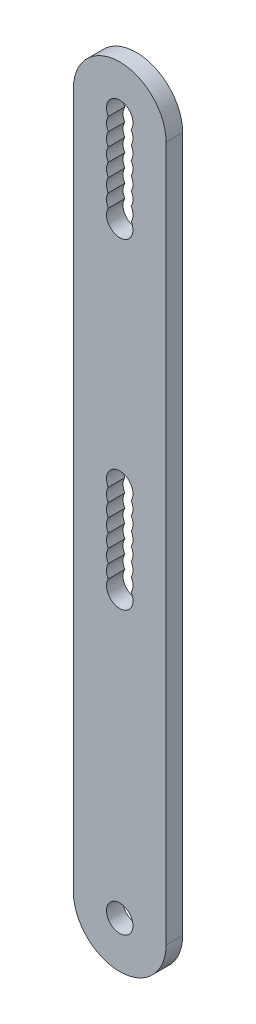
ISO-10303-21;
HEADER;
FILE_DESCRIPTION(('STEP AP214'),'2;1');
FILE_NAME('part.step','',(''),(''),'','','');
FILE_SCHEMA(('AUTOMOTIVE_DESIGN { 1 0 10303 214 1 1 1 1 }'));
ENDSEC;
DATA;
#1=APPLICATION_CONTEXT('core data for automotive mechanical design processes');
#2=APPLICATION_PROTOCOL_DEFINITION('international standard','automotive_design',2000,#1);
#3=PRODUCT_CONTEXT('',#1,'mechanical');
#4=PRODUCT('Part','Part','',(#3));
#5=PRODUCT_RELATED_PRODUCT_CATEGORY('part','',(#4));
#6=PRODUCT_DEFINITION_FORMATION('','',#4);
#7=PRODUCT_DEFINITION_CONTEXT('part definition',#1,'design');
#8=PRODUCT_DEFINITION('design','',#6,#7);
#9=PRODUCT_DEFINITION_SHAPE('','',#8);
#10=(LENGTH_UNIT() NAMED_UNIT(*) SI_UNIT(.MILLI.,.METRE.));
#11=(NAMED_UNIT(*) PLANE_ANGLE_UNIT() SI_UNIT($,.RADIAN.));
#12=(NAMED_UNIT(*) SI_UNIT($,.STERADIAN.) SOLID_ANGLE_UNIT());
#13=UNCERTAINTY_MEASURE_WITH_UNIT(LENGTH_MEASURE(1.E-05),#10,'distance_accuracy_value','');
#14=(GEOMETRIC_REPRESENTATION_CONTEXT(3) GLOBAL_UNCERTAINTY_ASSIGNED_CONTEXT((#13)) GLOBAL_UNIT_ASSIGNED_CONTEXT((#10,
#11,#12)) REPRESENTATION_CONTEXT('',''));
#15=CARTESIAN_POINT('',(0.,0.,0.));
#16=DIRECTION('',(0.,0.,1.));
#17=DIRECTION('',(1.,0.,0.));
#18=AXIS2_PLACEMENT_3D('',#15,#16,#17);
#19=CARTESIAN_POINT('',(14.,0.,2.5));
#20=DIRECTION('',(-1.,0.,0.));
#21=DIRECTION('',(0.,-1.,0.));
#22=AXIS2_PLACEMENT_3D('',#19,#20,#21);
#23=PLANE('',#22);
#24=DIRECTION('',(0.,1.,0.));
#25=VECTOR('',#24,1.);
#26=CARTESIAN_POINT('',(14.,0.,-2.5));
#27=LINE('',#26,#25);
#28=CARTESIAN_POINT('',(14.,-105.,-2.5));
#29=VERTEX_POINT('',#28);
#30=CARTESIAN_POINT('',(14.,105.,-2.5));
#31=VERTEX_POINT('',#30);
#32=EDGE_CURVE('E352',#29,#31,#27,.T.);
#33=ORIENTED_EDGE('',*,*,#32,.T.);
#34=DIRECTION('',(0.,0.,-1.));
#35=VECTOR('',#34,1.);
#36=CARTESIAN_POINT('',(14.,105.,2.5));
#37=LINE('',#36,#35);
#38=CARTESIAN_POINT('',(14.,105.,2.5));
#39=VERTEX_POINT('',#38);
#40=EDGE_CURVE('E11',#39,#31,#37,.T.);
#41=ORIENTED_EDGE('',*,*,#40,.F.);
#42=DIRECTION('',(0.,1.,0.));
#43=VECTOR('',#42,1.);
#44=CARTESIAN_POINT('',(14.,0.,2.5));
#45=LINE('',#44,#43);
#46=CARTESIAN_POINT('',(14.,-105.,2.5));
#47=VERTEX_POINT('',#46);
#48=EDGE_CURVE('E260',#47,#39,#45,.T.);
#49=ORIENTED_EDGE('',*,*,#48,.F.);
#50=DIRECTION('',(0.,0.,-1.));
#51=VECTOR('',#50,1.);
#52=CARTESIAN_POINT('',(14.,-105.,2.5));
#53=LINE('',#52,#51);
#54=EDGE_CURVE('E360',#47,#29,#53,.T.);
#55=ORIENTED_EDGE('',*,*,#54,.T.);
#56=EDGE_LOOP('',(#33,#41,#49,#55));
#57=FACE_BOUND('',#56,.T.);
#58=ADVANCED_FACE('F39',(#57),#23,.F.);
#59=CARTESIAN_POINT('',(0.,105.,2.5));
#60=DIRECTION('',(0.,0.,-1.));
#61=DIRECTION('',(-1.,0.,0.));
#62=AXIS2_PLACEMENT_3D('',#59,#60,#61);
#63=CYLINDRICAL_SURFACE('',#62,14.);
#64=CARTESIAN_POINT('',(0.,105.,-2.5));
#65=DIRECTION('',(0.,0.,1.));
#66=DIRECTION('',(1.,0.,0.));
#67=AXIS2_PLACEMENT_3D('',#64,#65,#66);
#68=CIRCLE('',#67,14.);
#69=CARTESIAN_POINT('',(-14.,105.,-2.5));
#70=VERTEX_POINT('',#69);
#71=EDGE_CURVE('E266',#31,#70,#68,.T.);
#72=ORIENTED_EDGE('',*,*,#71,.T.);
#73=DIRECTION('',(0.,0.,-1.));
#74=VECTOR('',#73,1.);
#75=CARTESIAN_POINT('',(-14.,105.,2.5));
#76=LINE('',#75,#74);
#77=CARTESIAN_POINT('',(-14.,105.,2.5));
#78=VERTEX_POINT('',#77);
#79=EDGE_CURVE('E49',#78,#70,#76,.T.);
#80=ORIENTED_EDGE('',*,*,#79,.F.);
#81=CARTESIAN_POINT('',(0.,105.,2.5));
#82=DIRECTION('',(0.,0.,1.));
#83=DIRECTION('',(1.,0.,0.));
#84=AXIS2_PLACEMENT_3D('',#81,#82,#83);
#85=CIRCLE('',#84,14.);
#86=EDGE_CURVE('E254',#39,#78,#85,.T.);
#87=ORIENTED_EDGE('',*,*,#86,.F.);
#88=ORIENTED_EDGE('',*,*,#40,.T.);
#89=EDGE_LOOP('',(#72,#80,#87,#88));
#90=FACE_BOUND('',#89,.T.);
#91=ADVANCED_FACE('F265',(#90),#63,.T.);
#92=CARTESIAN_POINT('',(-14.,0.,2.5));
#93=DIRECTION('',(-1.,0.,0.));
#94=DIRECTION('',(0.,-1.,0.));
#95=AXIS2_PLACEMENT_3D('',#92,#93,#94);
#96=PLANE('',#95);
#97=DIRECTION('',(0.,1.,0.));
#98=VECTOR('',#97,1.);
#99=CARTESIAN_POINT('',(-14.,0.,-2.5));
#100=LINE('',#99,#98);
#101=CARTESIAN_POINT('',(-14.,-105.,-2.5));
#102=VERTEX_POINT('',#101);
#103=EDGE_CURVE('E356',#102,#70,#100,.T.);
#104=ORIENTED_EDGE('',*,*,#103,.F.);
#105=DIRECTION('',(0.,0.,-1.));
#106=VECTOR('',#105,1.);
#107=CARTESIAN_POINT('',(-14.,-105.,2.5));
#108=LINE('',#107,#106);
#109=CARTESIAN_POINT('',(-14.,-105.,2.5));
#110=VERTEX_POINT('',#109);
#111=EDGE_CURVE('E158',#110,#102,#108,.T.);
#112=ORIENTED_EDGE('',*,*,#111,.F.);
#113=DIRECTION('',(0.,1.,0.));
#114=VECTOR('',#113,1.);
#115=CARTESIAN_POINT('',(-14.,0.,2.5));
#116=LINE('',#115,#114);
#117=EDGE_CURVE('E258',#110,#78,#116,.T.);
#118=ORIENTED_EDGE('',*,*,#117,.T.);
#119=ORIENTED_EDGE('',*,*,#79,.T.);
#120=EDGE_LOOP('',(#104,#112,#118,#119));
#121=FACE_BOUND('',#120,.T.);
#122=ADVANCED_FACE('F271',(#121),#96,.T.);
#123=CARTESIAN_POINT('',(0.,101.,2.5));
#124=DIRECTION('',(0.,0.,-1.));
#125=DIRECTION('',(-1.,0.,0.));
#126=AXIS2_PLACEMENT_3D('',#123,#124,#125);
#127=CYLINDRICAL_SURFACE('',#126,4.);
#128=CARTESIAN_POINT('',(0.,101.,-2.5));
#129=DIRECTION('',(0.,0.,1.));
#130=DIRECTION('',(1.,0.,0.));
#131=AXIS2_PLACEMENT_3D('',#128,#129,#130);
#132=CIRCLE('',#131,4.);
#133=CARTESIAN_POINT('',(-3.4641016151378,103.,-2.5));
#134=VERTEX_POINT('',#133);
#135=CARTESIAN_POINT('',(-3.46410161513779,99.,-2.5));
#136=VERTEX_POINT('',#135);
#137=EDGE_CURVE('E307',#134,#136,#132,.T.);
#138=ORIENTED_EDGE('',*,*,#137,.F.);
#139=DIRECTION('',(0.,0.,-1.));
#140=VECTOR('',#139,1.);
#141=CARTESIAN_POINT('',(-3.4641016151378,103.,2.5));
#142=LINE('',#141,#140);
#143=CARTESIAN_POINT('',(-3.4641016151378,103.,2.5));
#144=VERTEX_POINT('',#143);
#145=EDGE_CURVE('E362',#144,#134,#142,.T.);
#146=ORIENTED_EDGE('',*,*,#145,.F.);
#147=CARTESIAN_POINT('',(0.,101.,2.5));
#148=DIRECTION('',(0.,0.,1.));
#149=DIRECTION('',(1.,0.,0.));
#150=AXIS2_PLACEMENT_3D('',#147,#148,#149);
#151=CIRCLE('',#150,4.);
#152=CARTESIAN_POINT('',(-3.46410161513779,99.,2.5));
#153=VERTEX_POINT('',#152);
#154=EDGE_CURVE('E469',#144,#153,#151,.T.);
#155=ORIENTED_EDGE('',*,*,#154,.T.);
#156=DIRECTION('',(0.,0.,-1.));
#157=VECTOR('',#156,1.);
#158=CARTESIAN_POINT('',(-3.46410161513779,99.,2.5));
#159=LINE('',#158,#157);
#160=EDGE_CURVE('E364',#153,#136,#159,.T.);
#161=ORIENTED_EDGE('',*,*,#160,.T.);
#162=EDGE_LOOP('',(#138,#146,#155,#161));
#163=FACE_BOUND('',#162,.T.);
#164=ADVANCED_FACE('F591',(#163),#127,.F.);
#165=CARTESIAN_POINT('',(0.,105.,2.5));
#166=DIRECTION('',(0.,0.,-1.));
#167=DIRECTION('',(-1.,0.,0.));
#168=AXIS2_PLACEMENT_3D('',#165,#166,#167);
#169=CYLINDRICAL_SURFACE('',#168,4.00000000000001);
#170=CARTESIAN_POINT('',(0.,105.,-2.5));
#171=DIRECTION('',(0.,0.,1.));
#172=DIRECTION('',(1.,0.,0.));
#173=AXIS2_PLACEMENT_3D('',#170,#171,#172);
#174=CIRCLE('',#173,4.00000000000001);
#175=CARTESIAN_POINT('',(3.46410161513771,103.,-2.5));
#176=VERTEX_POINT('',#175);
#177=EDGE_CURVE('E310',#176,#134,#174,.T.);
#178=ORIENTED_EDGE('',*,*,#177,.F.);
#179=DIRECTION('',(0.,0.,-1.));
#180=VECTOR('',#179,1.);
#181=CARTESIAN_POINT('',(3.46410161513771,103.,2.5));
#182=LINE('',#181,#180);
#183=CARTESIAN_POINT('',(3.46410161513771,103.,2.5));
#184=VERTEX_POINT('',#183);
#185=EDGE_CURVE('E388',#184,#176,#182,.T.);
#186=ORIENTED_EDGE('',*,*,#185,.F.);
#187=CARTESIAN_POINT('',(0.,105.,2.5));
#188=DIRECTION('',(0.,0.,1.));
#189=DIRECTION('',(1.,0.,0.));
#190=AXIS2_PLACEMENT_3D('',#187,#188,#189);
#191=CIRCLE('',#190,4.00000000000001);
#192=EDGE_CURVE('E472',#184,#144,#191,.T.);
#193=ORIENTED_EDGE('',*,*,#192,.T.);
#194=ORIENTED_EDGE('',*,*,#145,.T.);
#195=EDGE_LOOP('',(#178,#186,#193,#194));
#196=FACE_BOUND('',#195,.T.);
#197=ADVANCED_FACE('F587',(#196),#169,.F.);
#198=CARTESIAN_POINT('',(0.,101.,2.5));
#199=DIRECTION('',(0.,0.,-1.));
#200=DIRECTION('',(-1.,0.,0.));
#201=AXIS2_PLACEMENT_3D('',#198,#199,#200);
#202=CYLINDRICAL_SURFACE('',#201,3.99999999999999);
#203=CARTESIAN_POINT('',(0.,101.,-2.5));
#204=DIRECTION('',(0.,0.,1.));
#205=DIRECTION('',(1.,0.,0.));
#206=AXIS2_PLACEMENT_3D('',#203,#204,#205);
#207=CIRCLE('',#206,3.99999999999999);
#208=CARTESIAN_POINT('',(3.46410161513771,99.,-2.5));
#209=VERTEX_POINT('',#208);
#210=EDGE_CURVE('E313',#209,#176,#207,.T.);
#211=ORIENTED_EDGE('',*,*,#210,.F.);
#212=DIRECTION('',(0.,0.,-1.));
#213=VECTOR('',#212,1.);
#214=CARTESIAN_POINT('',(3.46410161513771,99.,2.5));
#215=LINE('',#214,#213);
#216=CARTESIAN_POINT('',(3.46410161513771,99.,2.5));
#217=VERTEX_POINT('',#216);
#218=EDGE_CURVE('E386',#217,#209,#215,.T.);
#219=ORIENTED_EDGE('',*,*,#218,.F.);
#220=CARTESIAN_POINT('',(0.,101.,2.5));
#221=DIRECTION('',(0.,0.,1.));
#222=DIRECTION('',(1.,0.,0.));
#223=AXIS2_PLACEMENT_3D('',#220,#221,#222);
#224=CIRCLE('',#223,3.99999999999999);
#225=EDGE_CURVE('E475',#217,#184,#224,.T.);
#226=ORIENTED_EDGE('',*,*,#225,.T.);
#227=ORIENTED_EDGE('',*,*,#185,.T.);
#228=EDGE_LOOP('',(#211,#219,#226,#227));
#229=FACE_BOUND('',#228,.T.);
#230=ADVANCED_FACE('F583',(#229),#202,.F.);
#231=CARTESIAN_POINT('',(0.,97.,2.5));
#232=DIRECTION('',(0.,0.,-1.));
#233=DIRECTION('',(-1.,0.,0.));
#234=AXIS2_PLACEMENT_3D('',#231,#232,#233);
#235=CYLINDRICAL_SURFACE('',#234,4.);
#236=CARTESIAN_POINT('',(0.,97.,-2.5));
#237=DIRECTION('',(0.,0.,1.));
#238=DIRECTION('',(1.,0.,0.));
#239=AXIS2_PLACEMENT_3D('',#236,#237,#238);
#240=CIRCLE('',#239,4.);
#241=CARTESIAN_POINT('',(3.46410161513771,95.,-2.5));
#242=VERTEX_POINT('',#241);
#243=EDGE_CURVE('E316',#242,#209,#240,.T.);
#244=ORIENTED_EDGE('',*,*,#243,.F.);
#245=DIRECTION('',(0.,0.,-1.));
#246=VECTOR('',#245,1.);
#247=CARTESIAN_POINT('',(3.46410161513771,95.,2.5));
#248=LINE('',#247,#246);
#249=CARTESIAN_POINT('',(3.46410161513771,95.,2.5));
#250=VERTEX_POINT('',#249);
#251=EDGE_CURVE('E384',#250,#242,#248,.T.);
#252=ORIENTED_EDGE('',*,*,#251,.F.);
#253=CARTESIAN_POINT('',(0.,97.,2.5));
#254=DIRECTION('',(0.,0.,1.));
#255=DIRECTION('',(1.,0.,0.));
#256=AXIS2_PLACEMENT_3D('',#253,#254,#255);
#257=CIRCLE('',#256,4.);
#258=EDGE_CURVE('E478',#250,#217,#257,.T.);
#259=ORIENTED_EDGE('',*,*,#258,.T.);
#260=ORIENTED_EDGE('',*,*,#218,.T.);
#261=EDGE_LOOP('',(#244,#252,#259,#260));
#262=FACE_BOUND('',#261,.T.);
#263=ADVANCED_FACE('F579',(#262),#235,.F.);
#264=CARTESIAN_POINT('',(0.,93.,2.5));
#265=DIRECTION('',(0.,0.,-1.));
#266=DIRECTION('',(-1.,0.,0.));
#267=AXIS2_PLACEMENT_3D('',#264,#265,#266);
#268=CYLINDRICAL_SURFACE('',#267,4.);
#269=CARTESIAN_POINT('',(0.,93.,-2.5));
#270=DIRECTION('',(0.,0.,1.));
#271=DIRECTION('',(1.,0.,0.));
#272=AXIS2_PLACEMENT_3D('',#269,#270,#271);
#273=CIRCLE('',#272,4.);
#274=CARTESIAN_POINT('',(3.46410161513771,91.,-2.5));
#275=VERTEX_POINT('',#274);
#276=EDGE_CURVE('E319',#275,#242,#273,.T.);
#277=ORIENTED_EDGE('',*,*,#276,.F.);
#278=DIRECTION('',(0.,0.,-1.));
#279=VECTOR('',#278,1.);
#280=CARTESIAN_POINT('',(3.46410161513771,91.,2.5));
#281=LINE('',#280,#279);
#282=CARTESIAN_POINT('',(3.46410161513771,91.,2.5));
#283=VERTEX_POINT('',#282);
#284=EDGE_CURVE('E382',#283,#275,#281,.T.);
#285=ORIENTED_EDGE('',*,*,#284,.F.);
#286=CARTESIAN_POINT('',(0.,93.,2.5));
#287=DIRECTION('',(0.,0.,1.));
#288=DIRECTION('',(1.,0.,0.));
#289=AXIS2_PLACEMENT_3D('',#286,#287,#288);
#290=CIRCLE('',#289,4.);
#291=EDGE_CURVE('E481',#283,#250,#290,.T.);
#292=ORIENTED_EDGE('',*,*,#291,.T.);
#293=ORIENTED_EDGE('',*,*,#251,.T.);
#294=EDGE_LOOP('',(#277,#285,#292,#293));
#295=FACE_BOUND('',#294,.T.);
#296=ADVANCED_FACE('F575',(#295),#268,.F.);
#297=CARTESIAN_POINT('',(0.,89.,2.5));
#298=DIRECTION('',(0.,0.,-1.));
#299=DIRECTION('',(-1.,0.,0.));
#300=AXIS2_PLACEMENT_3D('',#297,#298,#299);
#301=CYLINDRICAL_SURFACE('',#300,4.);
#302=CARTESIAN_POINT('',(0.,89.,-2.5));
#303=DIRECTION('',(0.,0.,1.));
#304=DIRECTION('',(1.,0.,0.));
#305=AXIS2_PLACEMENT_3D('',#302,#303,#304);
#306=CIRCLE('',#305,4.);
#307=CARTESIAN_POINT('',(3.46410161513772,87.,-2.5));
#308=VERTEX_POINT('',#307);
#309=EDGE_CURVE('E322',#308,#275,#306,.T.);
#310=ORIENTED_EDGE('',*,*,#309,.F.);
#311=DIRECTION('',(0.,0.,-1.));
#312=VECTOR('',#311,1.);
#313=CARTESIAN_POINT('',(3.46410161513772,87.,2.5));
#314=LINE('',#313,#312);
#315=CARTESIAN_POINT('',(3.46410161513772,87.,2.5));
#316=VERTEX_POINT('',#315);
#317=EDGE_CURVE('E380',#316,#308,#314,.T.);
#318=ORIENTED_EDGE('',*,*,#317,.F.);
#319=CARTESIAN_POINT('',(0.,89.,2.5));
#320=DIRECTION('',(0.,0.,1.));
#321=DIRECTION('',(1.,0.,0.));
#322=AXIS2_PLACEMENT_3D('',#319,#320,#321);
#323=CIRCLE('',#322,4.);
#324=EDGE_CURVE('E484',#316,#283,#323,.T.);
#325=ORIENTED_EDGE('',*,*,#324,.T.);
#326=ORIENTED_EDGE('',*,*,#284,.T.);
#327=EDGE_LOOP('',(#310,#318,#325,#326));
#328=FACE_BOUND('',#327,.T.);
#329=ADVANCED_FACE('F571',(#328),#301,.F.);
#330=CARTESIAN_POINT('',(0.,85.,2.5));
#331=DIRECTION('',(0.,0.,-1.));
#332=DIRECTION('',(-1.,0.,0.));
#333=AXIS2_PLACEMENT_3D('',#330,#331,#332);
#334=CYLINDRICAL_SURFACE('',#333,4.);
#335=CARTESIAN_POINT('',(0.,85.,-2.5));
#336=DIRECTION('',(0.,0.,1.));
#337=DIRECTION('',(1.,0.,0.));
#338=AXIS2_PLACEMENT_3D('',#335,#336,#337);
#339=CIRCLE('',#338,4.);
#340=CARTESIAN_POINT('',(3.46410161513772,83.,-2.5));
#341=VERTEX_POINT('',#340);
#342=EDGE_CURVE('E325',#341,#308,#339,.T.);
#343=ORIENTED_EDGE('',*,*,#342,.F.);
#344=DIRECTION('',(0.,0.,-1.));
#345=VECTOR('',#344,1.);
#346=CARTESIAN_POINT('',(3.46410161513772,83.,2.5));
#347=LINE('',#346,#345);
#348=CARTESIAN_POINT('',(3.46410161513772,83.,2.5));
#349=VERTEX_POINT('',#348);
#350=EDGE_CURVE('E378',#349,#341,#347,.T.);
#351=ORIENTED_EDGE('',*,*,#350,.F.);
#352=CARTESIAN_POINT('',(0.,85.,2.5));
#353=DIRECTION('',(0.,0.,1.));
#354=DIRECTION('',(1.,0.,0.));
#355=AXIS2_PLACEMENT_3D('',#352,#353,#354);
#356=CIRCLE('',#355,4.);
#357=EDGE_CURVE('E487',#349,#316,#356,.T.);
#358=ORIENTED_EDGE('',*,*,#357,.T.);
#359=ORIENTED_EDGE('',*,*,#317,.T.);
#360=EDGE_LOOP('',(#343,#351,#358,#359));
#361=FACE_BOUND('',#360,.T.);
#362=ADVANCED_FACE('F567',(#361),#334,.F.);
#363=CARTESIAN_POINT('',(0.,81.,2.5));
#364=DIRECTION('',(0.,0.,-1.));
#365=DIRECTION('',(-1.,0.,0.));
#366=AXIS2_PLACEMENT_3D('',#363,#364,#365);
#367=CYLINDRICAL_SURFACE('',#366,4.);
#368=CARTESIAN_POINT('',(0.,81.,-2.5));
#369=DIRECTION('',(0.,0.,1.));
#370=DIRECTION('',(1.,0.,0.));
#371=AXIS2_PLACEMENT_3D('',#368,#369,#370);
#372=CIRCLE('',#371,4.);
#373=CARTESIAN_POINT('',(3.46410161513772,79.,-2.5));
#374=VERTEX_POINT('',#373);
#375=EDGE_CURVE('E328',#374,#341,#372,.T.);
#376=ORIENTED_EDGE('',*,*,#375,.F.);
#377=DIRECTION('',(0.,0.,-1.));
#378=VECTOR('',#377,1.);
#379=CARTESIAN_POINT('',(3.46410161513772,79.,2.5));
#380=LINE('',#379,#378);
#381=CARTESIAN_POINT('',(3.46410161513772,79.,2.5));
#382=VERTEX_POINT('',#381);
#383=EDGE_CURVE('E376',#382,#374,#380,.T.);
#384=ORIENTED_EDGE('',*,*,#383,.F.);
#385=CARTESIAN_POINT('',(0.,81.,2.5));
#386=DIRECTION('',(0.,0.,1.));
#387=DIRECTION('',(1.,0.,0.));
#388=AXIS2_PLACEMENT_3D('',#385,#386,#387);
#389=CIRCLE('',#388,4.);
#390=EDGE_CURVE('E490',#382,#349,#389,.T.);
#391=ORIENTED_EDGE('',*,*,#390,.T.);
#392=ORIENTED_EDGE('',*,*,#350,.T.);
#393=EDGE_LOOP('',(#376,#384,#391,#392));
#394=FACE_BOUND('',#393,.T.);
#395=ADVANCED_FACE('F563',(#394),#367,.F.);
#396=CARTESIAN_POINT('',(0.,77.,2.5));
#397=DIRECTION('',(0.,0.,-1.));
#398=DIRECTION('',(-1.,0.,0.));
#399=AXIS2_PLACEMENT_3D('',#396,#397,#398);
#400=CYLINDRICAL_SURFACE('',#399,4.);
#401=CARTESIAN_POINT('',(0.,77.,-2.5));
#402=DIRECTION('',(0.,0.,1.));
#403=DIRECTION('',(1.,0.,0.));
#404=AXIS2_PLACEMENT_3D('',#401,#402,#403);
#405=CIRCLE('',#404,4.);
#406=CARTESIAN_POINT('',(-3.4641016151378,79.,-2.5));
#407=VERTEX_POINT('',#406);
#408=EDGE_CURVE('E331',#407,#374,#405,.T.);
#409=ORIENTED_EDGE('',*,*,#408,.F.);
#410=DIRECTION('',(0.,0.,-1.));
#411=VECTOR('',#410,1.);
#412=CARTESIAN_POINT('',(-3.4641016151378,79.,2.5));
#413=LINE('',#412,#411);
#414=CARTESIAN_POINT('',(-3.4641016151378,79.,2.5));
#415=VERTEX_POINT('',#414);
#416=EDGE_CURVE('E374',#415,#407,#413,.T.);
#417=ORIENTED_EDGE('',*,*,#416,.F.);
#418=CARTESIAN_POINT('',(0.,77.,2.5));
#419=DIRECTION('',(0.,0.,1.));
#420=DIRECTION('',(1.,0.,0.));
#421=AXIS2_PLACEMENT_3D('',#418,#419,#420);
#422=CIRCLE('',#421,4.);
#423=EDGE_CURVE('E493',#415,#382,#422,.T.);
#424=ORIENTED_EDGE('',*,*,#423,.T.);
#425=ORIENTED_EDGE('',*,*,#383,.T.);
#426=EDGE_LOOP('',(#409,#417,#424,#425));
#427=FACE_BOUND('',#426,.T.);
#428=ADVANCED_FACE('F559',(#427),#400,.F.);
#429=CARTESIAN_POINT('',(0.,81.,2.5));
#430=DIRECTION('',(0.,0.,-1.));
#431=DIRECTION('',(-1.,0.,0.));
#432=AXIS2_PLACEMENT_3D('',#429,#430,#431);
#433=CYLINDRICAL_SURFACE('',#432,4.00000000000001);
#434=CARTESIAN_POINT('',(0.,81.,-2.5));
#435=DIRECTION('',(0.,0.,1.));
#436=DIRECTION('',(1.,0.,0.));
#437=AXIS2_PLACEMENT_3D('',#434,#435,#436);
#438=CIRCLE('',#437,4.00000000000001);
#439=CARTESIAN_POINT('',(-3.4641016151378,83.,-2.5));
#440=VERTEX_POINT('',#439);
#441=EDGE_CURVE('E334',#440,#407,#438,.T.);
#442=ORIENTED_EDGE('',*,*,#441,.F.);
#443=DIRECTION('',(0.,0.,-1.));
#444=VECTOR('',#443,1.);
#445=CARTESIAN_POINT('',(-3.4641016151378,83.,2.5));
#446=LINE('',#445,#444);
#447=CARTESIAN_POINT('',(-3.4641016151378,83.,2.5));
#448=VERTEX_POINT('',#447);
#449=EDGE_CURVE('E372',#448,#440,#446,.T.);
#450=ORIENTED_EDGE('',*,*,#449,.F.);
#451=CARTESIAN_POINT('',(0.,81.,2.5));
#452=DIRECTION('',(0.,0.,1.));
#453=DIRECTION('',(1.,0.,0.));
#454=AXIS2_PLACEMENT_3D('',#451,#452,#453);
#455=CIRCLE('',#454,4.00000000000001);
#456=EDGE_CURVE('E496',#448,#415,#455,.T.);
#457=ORIENTED_EDGE('',*,*,#456,.T.);
#458=ORIENTED_EDGE('',*,*,#416,.T.);
#459=EDGE_LOOP('',(#442,#450,#457,#458));
#460=FACE_BOUND('',#459,.T.);
#461=ADVANCED_FACE('F555',(#460),#433,.F.);
#462=CARTESIAN_POINT('',(0.,85.,2.5));
#463=DIRECTION('',(0.,0.,-1.));
#464=DIRECTION('',(-1.,0.,0.));
#465=AXIS2_PLACEMENT_3D('',#462,#463,#464);
#466=CYLINDRICAL_SURFACE('',#465,4.);
#467=CARTESIAN_POINT('',(0.,85.,-2.5));
#468=DIRECTION('',(0.,0.,1.));
#469=DIRECTION('',(1.,0.,0.));
#470=AXIS2_PLACEMENT_3D('',#467,#468,#469);
#471=CIRCLE('',#470,4.);
#472=CARTESIAN_POINT('',(-3.4641016151378,87.,-2.5));
#473=VERTEX_POINT('',#472);
#474=EDGE_CURVE('E337',#473,#440,#471,.T.);
#475=ORIENTED_EDGE('',*,*,#474,.F.);
#476=DIRECTION('',(0.,0.,-1.));
#477=VECTOR('',#476,1.);
#478=CARTESIAN_POINT('',(-3.4641016151378,87.,2.5));
#479=LINE('',#478,#477);
#480=CARTESIAN_POINT('',(-3.4641016151378,87.,2.5));
#481=VERTEX_POINT('',#480);
#482=EDGE_CURVE('E370',#481,#473,#479,.T.);
#483=ORIENTED_EDGE('',*,*,#482,.F.);
#484=CARTESIAN_POINT('',(0.,85.,2.5));
#485=DIRECTION('',(0.,0.,1.));
#486=DIRECTION('',(1.,0.,0.));
#487=AXIS2_PLACEMENT_3D('',#484,#485,#486);
#488=CIRCLE('',#487,4.);
#489=EDGE_CURVE('E499',#481,#448,#488,.T.);
#490=ORIENTED_EDGE('',*,*,#489,.T.);
#491=ORIENTED_EDGE('',*,*,#449,.T.);
#492=EDGE_LOOP('',(#475,#483,#490,#491));
#493=FACE_BOUND('',#492,.T.);
#494=ADVANCED_FACE('F551',(#493),#466,.F.);
#495=CARTESIAN_POINT('',(0.,89.,2.5));
#496=DIRECTION('',(0.,0.,-1.));
#497=DIRECTION('',(-1.,0.,0.));
#498=AXIS2_PLACEMENT_3D('',#495,#496,#497);
#499=CYLINDRICAL_SURFACE('',#498,4.);
#500=CARTESIAN_POINT('',(0.,89.,-2.5));
#501=DIRECTION('',(0.,0.,1.));
#502=DIRECTION('',(1.,0.,0.));
#503=AXIS2_PLACEMENT_3D('',#500,#501,#502);
#504=CIRCLE('',#503,4.);
#505=CARTESIAN_POINT('',(-3.4641016151378,91.,-2.5));
#506=VERTEX_POINT('',#505);
#507=EDGE_CURVE('E340',#506,#473,#504,.T.);
#508=ORIENTED_EDGE('',*,*,#507,.F.);
#509=DIRECTION('',(0.,0.,-1.));
#510=VECTOR('',#509,1.);
#511=CARTESIAN_POINT('',(-3.4641016151378,91.,2.5));
#512=LINE('',#511,#510);
#513=CARTESIAN_POINT('',(-3.4641016151378,91.,2.5));
#514=VERTEX_POINT('',#513);
#515=EDGE_CURVE('E368',#514,#506,#512,.T.);
#516=ORIENTED_EDGE('',*,*,#515,.F.);
#517=CARTESIAN_POINT('',(0.,89.,2.5));
#518=DIRECTION('',(0.,0.,1.));
#519=DIRECTION('',(1.,0.,0.));
#520=AXIS2_PLACEMENT_3D('',#517,#518,#519);
#521=CIRCLE('',#520,4.);
#522=EDGE_CURVE('E502',#514,#481,#521,.T.);
#523=ORIENTED_EDGE('',*,*,#522,.T.);
#524=ORIENTED_EDGE('',*,*,#482,.T.);
#525=EDGE_LOOP('',(#508,#516,#523,#524));
#526=FACE_BOUND('',#525,.T.);
#527=ADVANCED_FACE('F547',(#526),#499,.F.);
#528=CARTESIAN_POINT('',(0.,93.,2.5));
#529=DIRECTION('',(0.,0.,-1.));
#530=DIRECTION('',(-1.,0.,0.));
#531=AXIS2_PLACEMENT_3D('',#528,#529,#530);
#532=CYLINDRICAL_SURFACE('',#531,4.);
#533=CARTESIAN_POINT('',(0.,93.,-2.5));
#534=DIRECTION('',(0.,0.,1.));
#535=DIRECTION('',(1.,0.,0.));
#536=AXIS2_PLACEMENT_3D('',#533,#534,#535);
#537=CIRCLE('',#536,4.);
#538=CARTESIAN_POINT('',(-3.46410161513779,95.,-2.5));
#539=VERTEX_POINT('',#538);
#540=EDGE_CURVE('E343',#539,#506,#537,.T.);
#541=ORIENTED_EDGE('',*,*,#540,.F.);
#542=DIRECTION('',(0.,0.,-1.));
#543=VECTOR('',#542,1.);
#544=CARTESIAN_POINT('',(-3.46410161513779,95.,2.5));
#545=LINE('',#544,#543);
#546=CARTESIAN_POINT('',(-3.46410161513779,95.,2.5));
#547=VERTEX_POINT('',#546);
#548=EDGE_CURVE('E366',#547,#539,#545,.T.);
#549=ORIENTED_EDGE('',*,*,#548,.F.);
#550=CARTESIAN_POINT('',(0.,93.,2.5));
#551=DIRECTION('',(0.,0.,1.));
#552=DIRECTION('',(1.,0.,0.));
#553=AXIS2_PLACEMENT_3D('',#550,#551,#552);
#554=CIRCLE('',#553,4.);
#555=EDGE_CURVE('E505',#547,#514,#554,.T.);
#556=ORIENTED_EDGE('',*,*,#555,.T.);
#557=ORIENTED_EDGE('',*,*,#515,.T.);
#558=EDGE_LOOP('',(#541,#549,#556,#557));
#559=FACE_BOUND('',#558,.T.);
#560=ADVANCED_FACE('F544',(#559),#532,.F.);
#561=CARTESIAN_POINT('',(0.,-20.,2.5));
#562=DIRECTION('',(0.,0.,-1.));
#563=DIRECTION('',(-1.,0.,0.));
#564=AXIS2_PLACEMENT_3D('',#561,#562,#563);
#565=CYLINDRICAL_SURFACE('',#564,4.);
#566=CARTESIAN_POINT('',(0.,-20.,-2.5));
#567=DIRECTION('',(0.,0.,1.));
#568=DIRECTION('',(1.,0.,0.));
#569=AXIS2_PLACEMENT_3D('',#566,#567,#568);
#570=CIRCLE('',#569,4.);
#571=CARTESIAN_POINT('',(-3.46410161513776,-18.,-2.5));
#572=VERTEX_POINT('',#571);
#573=CARTESIAN_POINT('',(3.46410161513775,-18.,-2.5));
#574=VERTEX_POINT('',#573);
#575=EDGE_CURVE('E277',#572,#574,#570,.T.);
#576=ORIENTED_EDGE('',*,*,#575,.F.);
#577=DIRECTION('',(0.,0.,-1.));
#578=VECTOR('',#577,1.);
#579=CARTESIAN_POINT('',(-3.46410161513776,-18.,2.5));
#580=LINE('',#579,#578);
#581=CARTESIAN_POINT('',(-3.46410161513776,-18.,2.5));
#582=VERTEX_POINT('',#581);
#583=EDGE_CURVE('E43',#582,#572,#580,.T.);
#584=ORIENTED_EDGE('',*,*,#583,.F.);
#585=CARTESIAN_POINT('',(0.,-20.,2.5));
#586=DIRECTION('',(0.,0.,1.));
#587=DIRECTION('',(1.,0.,0.));
#588=AXIS2_PLACEMENT_3D('',#585,#586,#587);
#589=CIRCLE('',#588,4.);
#590=CARTESIAN_POINT('',(3.46410161513775,-18.,2.5));
#591=VERTEX_POINT('',#590);
#592=EDGE_CURVE('E359',#582,#591,#589,.T.);
#593=ORIENTED_EDGE('',*,*,#592,.T.);
#594=DIRECTION('',(0.,0.,-1.));
#595=VECTOR('',#594,1.);
#596=CARTESIAN_POINT('',(3.46410161513775,-18.,2.5));
#597=LINE('',#596,#595);
#598=EDGE_CURVE('E273',#591,#574,#597,.T.);
#599=ORIENTED_EDGE('',*,*,#598,.T.);
#600=EDGE_LOOP('',(#576,#584,#593,#599));
#601=FACE_BOUND('',#600,.T.);
#602=ADVANCED_FACE('F41',(#601),#565,.F.);
#603=CARTESIAN_POINT('',(0.,-16.,2.5));
#604=DIRECTION('',(0.,0.,-1.));
#605=DIRECTION('',(-1.,0.,0.));
#606=AXIS2_PLACEMENT_3D('',#603,#604,#605);
#607=CYLINDRICAL_SURFACE('',#606,4.);
#608=CARTESIAN_POINT('',(0.,-16.,-2.5));
#609=DIRECTION('',(0.,0.,1.));
#610=DIRECTION('',(1.,0.,0.));
#611=AXIS2_PLACEMENT_3D('',#608,#609,#610);
#612=CIRCLE('',#611,4.);
#613=CARTESIAN_POINT('',(-3.46410161513776,-14.,-2.5));
#614=VERTEX_POINT('',#613);
#615=EDGE_CURVE('E280',#614,#572,#612,.T.);
#616=ORIENTED_EDGE('',*,*,#615,.F.);
#617=DIRECTION('',(0.,0.,-1.));
#618=VECTOR('',#617,1.);
#619=CARTESIAN_POINT('',(-3.46410161513776,-14.,2.5));
#620=LINE('',#619,#618);
#621=CARTESIAN_POINT('',(-3.46410161513776,-14.,2.5));
#622=VERTEX_POINT('',#621);
#623=EDGE_CURVE('E413',#622,#614,#620,.T.);
#624=ORIENTED_EDGE('',*,*,#623,.F.);
#625=CARTESIAN_POINT('',(0.,-16.,2.5));
#626=DIRECTION('',(0.,0.,1.));
#627=DIRECTION('',(1.,0.,0.));
#628=AXIS2_PLACEMENT_3D('',#625,#626,#627);
#629=CIRCLE('',#628,4.);
#630=EDGE_CURVE('E422',#622,#582,#629,.T.);
#631=ORIENTED_EDGE('',*,*,#630,.T.);
#632=ORIENTED_EDGE('',*,*,#583,.T.);
#633=EDGE_LOOP('',(#616,#624,#631,#632));
#634=FACE_BOUND('',#633,.T.);
#635=ADVANCED_FACE('F420',(#634),#607,.F.);
#636=CARTESIAN_POINT('',(0.,-12.,2.5));
#637=DIRECTION('',(0.,0.,-1.));
#638=DIRECTION('',(-1.,0.,0.));
#639=AXIS2_PLACEMENT_3D('',#636,#637,#638);
#640=CYLINDRICAL_SURFACE('',#639,4.);
#641=CARTESIAN_POINT('',(0.,-12.,-2.5));
#642=DIRECTION('',(0.,0.,1.));
#643=DIRECTION('',(1.,0.,0.));
#644=AXIS2_PLACEMENT_3D('',#641,#642,#643);
#645=CIRCLE('',#644,4.);
#646=CARTESIAN_POINT('',(-3.46410161513777,-10.,-2.5));
#647=VERTEX_POINT('',#646);
#648=EDGE_CURVE('E283',#647,#614,#645,.T.);
#649=ORIENTED_EDGE('',*,*,#648,.F.);
#650=DIRECTION('',(0.,0.,-1.));
#651=VECTOR('',#650,1.);
#652=CARTESIAN_POINT('',(-3.46410161513777,-10.,2.5));
#653=LINE('',#652,#651);
#654=CARTESIAN_POINT('',(-3.46410161513777,-10.,2.5));
#655=VERTEX_POINT('',#654);
#656=EDGE_CURVE('E412',#655,#647,#653,.T.);
#657=ORIENTED_EDGE('',*,*,#656,.F.);
#658=CARTESIAN_POINT('',(0.,-12.,2.5));
#659=DIRECTION('',(0.,0.,1.));
#660=DIRECTION('',(1.,0.,0.));
#661=AXIS2_PLACEMENT_3D('',#658,#659,#660);
#662=CIRCLE('',#661,4.);
#663=EDGE_CURVE('E431',#655,#622,#662,.T.);
#664=ORIENTED_EDGE('',*,*,#663,.T.);
#665=ORIENTED_EDGE('',*,*,#623,.T.);
#666=EDGE_LOOP('',(#649,#657,#664,#665));
#667=FACE_BOUND('',#666,.T.);
#668=ADVANCED_FACE('F429',(#667),#640,.F.);
#669=CARTESIAN_POINT('',(0.,-8.,2.5));
#670=DIRECTION('',(0.,0.,-1.));
#671=DIRECTION('',(-1.,0.,0.));
#672=AXIS2_PLACEMENT_3D('',#669,#670,#671);
#673=CYLINDRICAL_SURFACE('',#672,4.);
#674=CARTESIAN_POINT('',(0.,-8.,-2.5));
#675=DIRECTION('',(0.,0.,1.));
#676=DIRECTION('',(1.,0.,0.));
#677=AXIS2_PLACEMENT_3D('',#674,#675,#676);
#678=CIRCLE('',#677,4.);
#679=CARTESIAN_POINT('',(-3.46410161513777,-6.,-2.5));
#680=VERTEX_POINT('',#679);
#681=EDGE_CURVE('E287',#680,#647,#678,.T.);
#682=ORIENTED_EDGE('',*,*,#681,.F.);
#683=DIRECTION('',(0.,0.,-1.));
#684=VECTOR('',#683,1.);
#685=CARTESIAN_POINT('',(-3.46410161513777,-6.,2.5));
#686=LINE('',#685,#684);
#687=CARTESIAN_POINT('',(-3.46410161513777,-6.,2.5));
#688=VERTEX_POINT('',#687);
#689=EDGE_CURVE('E410',#688,#680,#686,.T.);
#690=ORIENTED_EDGE('',*,*,#689,.F.);
#691=CARTESIAN_POINT('',(0.,-8.,2.5));
#692=DIRECTION('',(0.,0.,1.));
#693=DIRECTION('',(1.,0.,0.));
#694=AXIS2_PLACEMENT_3D('',#691,#692,#693);
#695=CIRCLE('',#694,4.);
#696=EDGE_CURVE('E438',#688,#655,#695,.T.);
#697=ORIENTED_EDGE('',*,*,#696,.T.);
#698=ORIENTED_EDGE('',*,*,#656,.T.);
#699=EDGE_LOOP('',(#682,#690,#697,#698));
#700=FACE_BOUND('',#699,.T.);
#701=ADVANCED_FACE('F442',(#700),#673,.F.);
#702=CARTESIAN_POINT('',(0.,-4.,2.5));
#703=DIRECTION('',(0.,0.,-1.));
#704=DIRECTION('',(-1.,0.,0.));
#705=AXIS2_PLACEMENT_3D('',#702,#703,#704);
#706=CYLINDRICAL_SURFACE('',#705,4.);
#707=CARTESIAN_POINT('',(0.,-4.,-2.5));
#708=DIRECTION('',(0.,0.,1.));
#709=DIRECTION('',(1.,0.,0.));
#710=AXIS2_PLACEMENT_3D('',#707,#708,#709);
#711=CIRCLE('',#710,4.);
#712=CARTESIAN_POINT('',(-3.46410161513777,-2.,-2.5));
#713=VERTEX_POINT('',#712);
#714=EDGE_CURVE('E291',#713,#680,#711,.T.);
#715=ORIENTED_EDGE('',*,*,#714,.F.);
#716=DIRECTION('',(0.,0.,-1.));
#717=VECTOR('',#716,1.);
#718=CARTESIAN_POINT('',(-3.46410161513777,-2.,2.5));
#719=LINE('',#718,#717);
#720=CARTESIAN_POINT('',(-3.46410161513777,-2.,2.5));
#721=VERTEX_POINT('',#720);
#722=EDGE_CURVE('E408',#721,#713,#719,.T.);
#723=ORIENTED_EDGE('',*,*,#722,.F.);
#724=CARTESIAN_POINT('',(0.,-4.,2.5));
#725=DIRECTION('',(0.,0.,1.));
#726=DIRECTION('',(1.,0.,0.));
#727=AXIS2_PLACEMENT_3D('',#724,#725,#726);
#728=CIRCLE('',#727,4.);
#729=EDGE_CURVE('E443',#721,#688,#728,.T.);
#730=ORIENTED_EDGE('',*,*,#729,.T.);
#731=ORIENTED_EDGE('',*,*,#689,.T.);
#732=EDGE_LOOP('',(#715,#723,#730,#731));
#733=FACE_BOUND('',#732,.T.);
#734=ADVANCED_FACE('F609',(#733),#706,.F.);
#735=CARTESIAN_POINT('',(0.,0.,2.5));
#736=DIRECTION('',(0.,0.,-1.));
#737=DIRECTION('',(-1.,0.,0.));
#738=AXIS2_PLACEMENT_3D('',#735,#736,#737);
#739=CYLINDRICAL_SURFACE('',#738,4.);
#740=CARTESIAN_POINT('',(0.,0.,-2.5));
#741=DIRECTION('',(0.,0.,1.));
#742=DIRECTION('',(1.,0.,0.));
#743=AXIS2_PLACEMENT_3D('',#740,#741,#742);
#744=CIRCLE('',#743,4.);
#745=CARTESIAN_POINT('',(-3.46410161513777,2.,-2.5));
#746=VERTEX_POINT('',#745);
#747=EDGE_CURVE('E295',#746,#713,#744,.T.);
#748=ORIENTED_EDGE('',*,*,#747,.F.);
#749=DIRECTION('',(0.,0.,-1.));
#750=VECTOR('',#749,1.);
#751=CARTESIAN_POINT('',(-3.46410161513777,2.,2.5));
#752=LINE('',#751,#750);
#753=CARTESIAN_POINT('',(-3.46410161513777,2.,2.5));
#754=VERTEX_POINT('',#753);
#755=EDGE_CURVE('E406',#754,#746,#752,.T.);
#756=ORIENTED_EDGE('',*,*,#755,.F.);
#757=CARTESIAN_POINT('',(0.,0.,2.5));
#758=DIRECTION('',(0.,0.,1.));
#759=DIRECTION('',(1.,0.,0.));
#760=AXIS2_PLACEMENT_3D('',#757,#758,#759);
#761=CIRCLE('',#760,4.);
#762=EDGE_CURVE('E446',#754,#721,#761,.T.);
#763=ORIENTED_EDGE('',*,*,#762,.T.);
#764=ORIENTED_EDGE('',*,*,#722,.T.);
#765=EDGE_LOOP('',(#748,#756,#763,#764));
#766=FACE_BOUND('',#765,.T.);
#767=ADVANCED_FACE('F614',(#766),#739,.F.);
#768=CARTESIAN_POINT('',(0.,4.,2.5));
#769=DIRECTION('',(0.,0.,-1.));
#770=DIRECTION('',(-1.,0.,0.));
#771=AXIS2_PLACEMENT_3D('',#768,#769,#770);
#772=CYLINDRICAL_SURFACE('',#771,4.);
#773=CARTESIAN_POINT('',(0.,4.,-2.5));
#774=DIRECTION('',(0.,0.,1.));
#775=DIRECTION('',(1.,0.,0.));
#776=AXIS2_PLACEMENT_3D('',#773,#774,#775);
#777=CIRCLE('',#776,4.);
#778=CARTESIAN_POINT('',(-3.46410161513777,6.,-2.5));
#779=VERTEX_POINT('',#778);
#780=EDGE_CURVE('E299',#779,#746,#777,.T.);
#781=ORIENTED_EDGE('',*,*,#780,.F.);
#782=DIRECTION('',(0.,0.,-1.));
#783=VECTOR('',#782,1.);
#784=CARTESIAN_POINT('',(-3.46410161513777,6.,2.5));
#785=LINE('',#784,#783);
#786=CARTESIAN_POINT('',(-3.46410161513777,6.,2.5));
#787=VERTEX_POINT('',#786);
#788=EDGE_CURVE('E404',#787,#779,#785,.T.);
#789=ORIENTED_EDGE('',*,*,#788,.F.);
#790=CARTESIAN_POINT('',(0.,4.,2.5));
#791=DIRECTION('',(0.,0.,1.));
#792=DIRECTION('',(1.,0.,0.));
#793=AXIS2_PLACEMENT_3D('',#790,#791,#792);
#794=CIRCLE('',#793,4.);
#795=EDGE_CURVE('E463',#787,#754,#794,.T.);
#796=ORIENTED_EDGE('',*,*,#795,.T.);
#797=ORIENTED_EDGE('',*,*,#755,.T.);
#798=EDGE_LOOP('',(#781,#789,#796,#797));
#799=FACE_BOUND('',#798,.T.);
#800=ADVANCED_FACE('F618',(#799),#772,.F.);
#801=CARTESIAN_POINT('',(0.,8.,2.5));
#802=DIRECTION('',(0.,0.,-1.));
#803=DIRECTION('',(-1.,0.,0.));
#804=AXIS2_PLACEMENT_3D('',#801,#802,#803);
#805=CYLINDRICAL_SURFACE('',#804,4.);
#806=CARTESIAN_POINT('',(0.,8.,-2.5));
#807=DIRECTION('',(0.,0.,1.));
#808=DIRECTION('',(1.,0.,0.));
#809=AXIS2_PLACEMENT_3D('',#806,#807,#808);
#810=CIRCLE('',#809,4.);
#811=CARTESIAN_POINT('',(3.46410161513774,6.,-2.5));
#812=VERTEX_POINT('',#811);
#813=EDGE_CURVE('E303',#812,#779,#810,.T.);
#814=ORIENTED_EDGE('',*,*,#813,.F.);
#815=DIRECTION('',(0.,0.,-1.));
#816=VECTOR('',#815,1.);
#817=CARTESIAN_POINT('',(3.46410161513774,6.,2.5));
#818=LINE('',#817,#816);
#819=CARTESIAN_POINT('',(3.46410161513774,6.,2.5));
#820=VERTEX_POINT('',#819);
#821=EDGE_CURVE('E402',#820,#812,#818,.T.);
#822=ORIENTED_EDGE('',*,*,#821,.F.);
#823=CARTESIAN_POINT('',(0.,8.,2.5));
#824=DIRECTION('',(0.,0.,1.));
#825=DIRECTION('',(1.,0.,0.));
#826=AXIS2_PLACEMENT_3D('',#823,#824,#825);
#827=CIRCLE('',#826,4.);
#828=EDGE_CURVE('E466',#820,#787,#827,.T.);
#829=ORIENTED_EDGE('',*,*,#828,.T.);
#830=ORIENTED_EDGE('',*,*,#788,.T.);
#831=EDGE_LOOP('',(#814,#822,#829,#830));
#832=FACE_BOUND('',#831,.T.);
#833=ADVANCED_FACE('F616',(#832),#805,.F.);
#834=CARTESIAN_POINT('',(3.46410161513774,2.,-2.5));
#835=VERTEX_POINT('',#834);
#836=EDGE_CURVE('E304',#835,#812,#777,.T.);
#837=ORIENTED_EDGE('',*,*,#836,.F.);
#838=DIRECTION('',(0.,0.,-1.));
#839=VECTOR('',#838,1.);
#840=CARTESIAN_POINT('',(3.46410161513774,2.,2.5));
#841=LINE('',#840,#839);
#842=CARTESIAN_POINT('',(3.46410161513774,2.,2.5));
#843=VERTEX_POINT('',#842);
#844=EDGE_CURVE('E400',#843,#835,#841,.T.);
#845=ORIENTED_EDGE('',*,*,#844,.F.);
#846=EDGE_CURVE('E459',#843,#820,#794,.T.);
#847=ORIENTED_EDGE('',*,*,#846,.T.);
#848=ORIENTED_EDGE('',*,*,#821,.T.);
#849=EDGE_LOOP('',(#837,#845,#847,#848));
#850=FACE_BOUND('',#849,.T.);
#851=ADVANCED_FACE('F612',(#850),#772,.F.);
#852=CARTESIAN_POINT('',(3.46410161513774,-2.,-2.5));
#853=VERTEX_POINT('',#852);
#854=EDGE_CURVE('E300',#853,#835,#744,.T.);
#855=ORIENTED_EDGE('',*,*,#854,.F.);
#856=DIRECTION('',(0.,0.,-1.));
#857=VECTOR('',#856,1.);
#858=CARTESIAN_POINT('',(3.46410161513774,-2.,2.5));
#859=LINE('',#858,#857);
#860=CARTESIAN_POINT('',(3.46410161513774,-2.,2.5));
#861=VERTEX_POINT('',#860);
#862=EDGE_CURVE('E398',#861,#853,#859,.T.);
#863=ORIENTED_EDGE('',*,*,#862,.F.);
#864=EDGE_CURVE('E455',#861,#843,#761,.T.);
#865=ORIENTED_EDGE('',*,*,#864,.T.);
#866=ORIENTED_EDGE('',*,*,#844,.T.);
#867=EDGE_LOOP('',(#855,#863,#865,#866));
#868=FACE_BOUND('',#867,.T.);
#869=ADVANCED_FACE('F608',(#868),#739,.F.);
#870=CARTESIAN_POINT('',(3.46410161513774,-6.,-2.5));
#871=VERTEX_POINT('',#870);
#872=EDGE_CURVE('E296',#871,#853,#711,.T.);
#873=ORIENTED_EDGE('',*,*,#872,.F.);
#874=DIRECTION('',(0.,0.,-1.));
#875=VECTOR('',#874,1.);
#876=CARTESIAN_POINT('',(3.46410161513774,-6.,2.5));
#877=LINE('',#876,#875);
#878=CARTESIAN_POINT('',(3.46410161513774,-6.,2.5));
#879=VERTEX_POINT('',#878);
#880=EDGE_CURVE('E396',#879,#871,#877,.T.);
#881=ORIENTED_EDGE('',*,*,#880,.F.);
#882=EDGE_CURVE('E448',#879,#861,#728,.T.);
#883=ORIENTED_EDGE('',*,*,#882,.T.);
#884=ORIENTED_EDGE('',*,*,#862,.T.);
#885=EDGE_LOOP('',(#873,#881,#883,#884));
#886=FACE_BOUND('',#885,.T.);
#887=ADVANCED_FACE('F605',(#886),#706,.F.);
#888=CARTESIAN_POINT('',(3.46410161513775,-10.,-2.5));
#889=VERTEX_POINT('',#888);
#890=EDGE_CURVE('E292',#889,#871,#678,.T.);
#891=ORIENTED_EDGE('',*,*,#890,.F.);
#892=DIRECTION('',(0.,0.,-1.));
#893=VECTOR('',#892,1.);
#894=CARTESIAN_POINT('',(3.46410161513775,-10.,2.5));
#895=LINE('',#894,#893);
#896=CARTESIAN_POINT('',(3.46410161513775,-10.,2.5));
#897=VERTEX_POINT('',#896);
#898=EDGE_CURVE('E394',#897,#889,#895,.T.);
#899=ORIENTED_EDGE('',*,*,#898,.F.);
#900=EDGE_CURVE('E445',#897,#879,#695,.T.);
#901=ORIENTED_EDGE('',*,*,#900,.T.);
#902=ORIENTED_EDGE('',*,*,#880,.T.);
#903=EDGE_LOOP('',(#891,#899,#901,#902));
#904=FACE_BOUND('',#903,.T.);
#905=ADVANCED_FACE('F601',(#904),#673,.F.);
#906=CARTESIAN_POINT('',(3.46410161513775,-14.,-2.5));
#907=VERTEX_POINT('',#906);
#908=EDGE_CURVE('E288',#907,#889,#645,.T.);
#909=ORIENTED_EDGE('',*,*,#908,.F.);
#910=DIRECTION('',(0.,0.,-1.));
#911=VECTOR('',#910,1.);
#912=CARTESIAN_POINT('',(3.46410161513775,-14.,2.5));
#913=LINE('',#912,#911);
#914=CARTESIAN_POINT('',(3.46410161513775,-14.,2.5));
#915=VERTEX_POINT('',#914);
#916=EDGE_CURVE('E392',#915,#907,#913,.T.);
#917=ORIENTED_EDGE('',*,*,#916,.F.);
#918=EDGE_CURVE('E441',#915,#897,#662,.T.);
#919=ORIENTED_EDGE('',*,*,#918,.T.);
#920=ORIENTED_EDGE('',*,*,#898,.T.);
#921=EDGE_LOOP('',(#909,#917,#919,#920));
#922=FACE_BOUND('',#921,.T.);
#923=ADVANCED_FACE('F540',(#922),#640,.F.);
#924=CARTESIAN_POINT('',(0.,-105.,2.5));
#925=DIRECTION('',(0.,0.,-1.));
#926=DIRECTION('',(-1.,0.,0.));
#927=AXIS2_PLACEMENT_3D('',#924,#925,#926);
#928=CYLINDRICAL_SURFACE('',#927,4.00000000000001);
#929=CARTESIAN_POINT('',(0.,-105.,2.5));
#930=DIRECTION('',(0.,0.,1.));
#931=DIRECTION('',(1.,0.,0.));
#932=AXIS2_PLACEMENT_3D('',#929,#930,#931);
#933=CIRCLE('',#932,4.00000000000001);
#934=CARTESIAN_POINT('',(4.00000000000002,-105.,2.5));
#935=VERTEX_POINT('',#934);
#936=EDGE_CURVE('E511',#935,#935,#933,.T.);
#937=ORIENTED_EDGE('',*,*,#936,.T.);
#938=EDGE_LOOP('',(#937));
#939=FACE_BOUND('',#938,.T.);
#940=CARTESIAN_POINT('',(0.,-105.,-2.5));
#941=DIRECTION('',(0.,0.,1.));
#942=DIRECTION('',(1.,0.,0.));
#943=AXIS2_PLACEMENT_3D('',#940,#941,#942);
#944=CIRCLE('',#943,4.00000000000001);
#945=CARTESIAN_POINT('',(4.00000000000002,-105.,-2.5));
#946=VERTEX_POINT('',#945);
#947=EDGE_CURVE('E349',#946,#946,#944,.T.);
#948=ORIENTED_EDGE('',*,*,#947,.F.);
#949=EDGE_LOOP('',(#948));
#950=FACE_BOUND('',#949,.T.);
#951=ADVANCED_FACE('F515',(#939,#950),#928,.F.);
#952=CARTESIAN_POINT('',(0.,97.,2.5));
#953=DIRECTION('',(0.,0.,-1.));
#954=DIRECTION('',(-1.,0.,0.));
#955=AXIS2_PLACEMENT_3D('',#952,#953,#954);
#956=CYLINDRICAL_SURFACE('',#955,3.99999999999999);
#957=CARTESIAN_POINT('',(0.,97.,-2.5));
#958=DIRECTION('',(0.,0.,1.));
#959=DIRECTION('',(1.,0.,0.));
#960=AXIS2_PLACEMENT_3D('',#957,#958,#959);
#961=CIRCLE('',#960,3.99999999999999);
#962=EDGE_CURVE('E346',#136,#539,#961,.T.);
#963=ORIENTED_EDGE('',*,*,#962,.F.);
#964=ORIENTED_EDGE('',*,*,#160,.F.);
#965=CARTESIAN_POINT('',(0.,97.,2.5));
#966=DIRECTION('',(0.,0.,1.));
#967=DIRECTION('',(1.,0.,0.));
#968=AXIS2_PLACEMENT_3D('',#965,#966,#967);
#969=CIRCLE('',#968,3.99999999999999);
#970=EDGE_CURVE('E508',#153,#547,#969,.T.);
#971=ORIENTED_EDGE('',*,*,#970,.T.);
#972=ORIENTED_EDGE('',*,*,#548,.T.);
#973=EDGE_LOOP('',(#963,#964,#971,#972));
#974=FACE_BOUND('',#973,.T.);
#975=ADVANCED_FACE('F539',(#974),#956,.F.);
#976=EDGE_CURVE('E284',#574,#907,#612,.T.);
#977=ORIENTED_EDGE('',*,*,#976,.F.);
#978=ORIENTED_EDGE('',*,*,#598,.F.);
#979=EDGE_CURVE('E453',#591,#915,#629,.T.);
#980=ORIENTED_EDGE('',*,*,#979,.T.);
#981=ORIENTED_EDGE('',*,*,#916,.T.);
#982=EDGE_LOOP('',(#977,#978,#980,#981));
#983=FACE_BOUND('',#982,.T.);
#984=ADVANCED_FACE('F526',(#983),#607,.F.);
#985=CARTESIAN_POINT('',(0.,-105.,2.5));
#986=DIRECTION('',(0.,0.,-1.));
#987=DIRECTION('',(-1.,0.,0.));
#988=AXIS2_PLACEMENT_3D('',#985,#986,#987);
#989=CYLINDRICAL_SURFACE('',#988,14.);
#990=CARTESIAN_POINT('',(0.,-105.,-2.5));
#991=DIRECTION('',(0.,0.,1.));
#992=DIRECTION('',(1.,0.,0.));
#993=AXIS2_PLACEMENT_3D('',#990,#991,#992);
#994=CIRCLE('',#993,14.);
#995=EDGE_CURVE('E161',#102,#29,#994,.T.);
#996=ORIENTED_EDGE('',*,*,#995,.T.);
#997=ORIENTED_EDGE('',*,*,#54,.F.);
#998=CARTESIAN_POINT('',(0.,-105.,2.5));
#999=DIRECTION('',(0.,0.,1.));
#1000=DIRECTION('',(1.,0.,0.));
#1001=AXIS2_PLACEMENT_3D('',#998,#999,#1000);
#1002=CIRCLE('',#1001,14.);
#1003=EDGE_CURVE('E58',#110,#47,#1002,.T.);
#1004=ORIENTED_EDGE('',*,*,#1003,.F.);
#1005=ORIENTED_EDGE('',*,*,#111,.T.);
#1006=EDGE_LOOP('',(#996,#997,#1004,#1005));
#1007=FACE_BOUND('',#1006,.T.);
#1008=ADVANCED_FACE('F519',(#1007),#989,.T.);
#1009=CARTESIAN_POINT('',(0.,0.,2.5));
#1010=DIRECTION('',(0.,0.,1.));
#1011=DIRECTION('',(1.,0.,0.));
#1012=AXIS2_PLACEMENT_3D('',#1009,#1010,#1011);
#1013=PLANE('',#1012);
#1014=ORIENTED_EDGE('',*,*,#592,.F.);
#1015=ORIENTED_EDGE('',*,*,#630,.F.);
#1016=ORIENTED_EDGE('',*,*,#663,.F.);
#1017=ORIENTED_EDGE('',*,*,#696,.F.);
#1018=ORIENTED_EDGE('',*,*,#729,.F.);
#1019=ORIENTED_EDGE('',*,*,#762,.F.);
#1020=ORIENTED_EDGE('',*,*,#795,.F.);
#1021=ORIENTED_EDGE('',*,*,#828,.F.);
#1022=ORIENTED_EDGE('',*,*,#846,.F.);
#1023=ORIENTED_EDGE('',*,*,#864,.F.);
#1024=ORIENTED_EDGE('',*,*,#882,.F.);
#1025=ORIENTED_EDGE('',*,*,#900,.F.);
#1026=ORIENTED_EDGE('',*,*,#918,.F.);
#1027=ORIENTED_EDGE('',*,*,#979,.F.);
#1028=EDGE_LOOP('',(#1014,#1015,#1016,#1017,#1018,#1019,#1020,#1021,#1022,#1023,#1024,#1025,
#1026,#1027));
#1029=FACE_BOUND('',#1028,.T.);
#1030=ORIENTED_EDGE('',*,*,#154,.F.);
#1031=ORIENTED_EDGE('',*,*,#192,.F.);
#1032=ORIENTED_EDGE('',*,*,#225,.F.);
#1033=ORIENTED_EDGE('',*,*,#258,.F.);
#1034=ORIENTED_EDGE('',*,*,#291,.F.);
#1035=ORIENTED_EDGE('',*,*,#324,.F.);
#1036=ORIENTED_EDGE('',*,*,#357,.F.);
#1037=ORIENTED_EDGE('',*,*,#390,.F.);
#1038=ORIENTED_EDGE('',*,*,#423,.F.);
#1039=ORIENTED_EDGE('',*,*,#456,.F.);
#1040=ORIENTED_EDGE('',*,*,#489,.F.);
#1041=ORIENTED_EDGE('',*,*,#522,.F.);
#1042=ORIENTED_EDGE('',*,*,#555,.F.);
#1043=ORIENTED_EDGE('',*,*,#970,.F.);
#1044=EDGE_LOOP('',(#1030,#1031,#1032,#1033,#1034,#1035,#1036,#1037,#1038,#1039,#1040,#1041,
#1042,#1043));
#1045=FACE_BOUND('',#1044,.T.);
#1046=ORIENTED_EDGE('',*,*,#936,.F.);
#1047=EDGE_LOOP('',(#1046));
#1048=FACE_BOUND('',#1047,.T.);
#1049=ORIENTED_EDGE('',*,*,#48,.T.);
#1050=ORIENTED_EDGE('',*,*,#86,.T.);
#1051=ORIENTED_EDGE('',*,*,#117,.F.);
#1052=ORIENTED_EDGE('',*,*,#1003,.T.);
#1053=EDGE_LOOP('',(#1049,#1050,#1051,#1052));
#1054=FACE_BOUND('',#1053,.T.);
#1055=ADVANCED_FACE('F256',(#1029,#1045,#1048,#1054),#1013,.T.);
#1056=CARTESIAN_POINT('',(0.,0.,-2.5));
#1057=DIRECTION('',(0.,0.,1.));
#1058=DIRECTION('',(1.,0.,0.));
#1059=AXIS2_PLACEMENT_3D('',#1056,#1057,#1058);
#1060=PLANE('',#1059);
#1061=ORIENTED_EDGE('',*,*,#575,.T.);
#1062=ORIENTED_EDGE('',*,*,#976,.T.);
#1063=ORIENTED_EDGE('',*,*,#908,.T.);
#1064=ORIENTED_EDGE('',*,*,#890,.T.);
#1065=ORIENTED_EDGE('',*,*,#872,.T.);
#1066=ORIENTED_EDGE('',*,*,#854,.T.);
#1067=ORIENTED_EDGE('',*,*,#836,.T.);
#1068=ORIENTED_EDGE('',*,*,#813,.T.);
#1069=ORIENTED_EDGE('',*,*,#780,.T.);
#1070=ORIENTED_EDGE('',*,*,#747,.T.);
#1071=ORIENTED_EDGE('',*,*,#714,.T.);
#1072=ORIENTED_EDGE('',*,*,#681,.T.);
#1073=ORIENTED_EDGE('',*,*,#648,.T.);
#1074=ORIENTED_EDGE('',*,*,#615,.T.);
#1075=EDGE_LOOP('',(#1061,#1062,#1063,#1064,#1065,#1066,#1067,#1068,#1069,#1070,#1071,#1072,
#1073,#1074));
#1076=FACE_BOUND('',#1075,.T.);
#1077=ORIENTED_EDGE('',*,*,#137,.T.);
#1078=ORIENTED_EDGE('',*,*,#962,.T.);
#1079=ORIENTED_EDGE('',*,*,#540,.T.);
#1080=ORIENTED_EDGE('',*,*,#507,.T.);
#1081=ORIENTED_EDGE('',*,*,#474,.T.);
#1082=ORIENTED_EDGE('',*,*,#441,.T.);
#1083=ORIENTED_EDGE('',*,*,#408,.T.);
#1084=ORIENTED_EDGE('',*,*,#375,.T.);
#1085=ORIENTED_EDGE('',*,*,#342,.T.);
#1086=ORIENTED_EDGE('',*,*,#309,.T.);
#1087=ORIENTED_EDGE('',*,*,#276,.T.);
#1088=ORIENTED_EDGE('',*,*,#243,.T.);
#1089=ORIENTED_EDGE('',*,*,#210,.T.);
#1090=ORIENTED_EDGE('',*,*,#177,.T.);
#1091=EDGE_LOOP('',(#1077,#1078,#1079,#1080,#1081,#1082,#1083,#1084,#1085,#1086,#1087,#1088,
#1089,#1090));
#1092=FACE_BOUND('',#1091,.T.);
#1093=ORIENTED_EDGE('',*,*,#947,.T.);
#1094=EDGE_LOOP('',(#1093));
#1095=FACE_BOUND('',#1094,.T.);
#1096=ORIENTED_EDGE('',*,*,#32,.F.);
#1097=ORIENTED_EDGE('',*,*,#995,.F.);
#1098=ORIENTED_EDGE('',*,*,#103,.T.);
#1099=ORIENTED_EDGE('',*,*,#71,.F.);
#1100=EDGE_LOOP('',(#1096,#1097,#1098,#1099));
#1101=FACE_BOUND('',#1100,.T.);
#1102=ADVANCED_FACE('F426',(#1076,#1092,#1095,#1101),#1060,.F.);
#1103=CLOSED_SHELL('',(#58,#91,#122,#164,#197,#230,#263,#296,#329,#362,#395,#428,#461,#494,#527,
#560,#602,#635,#668,#701,#734,#767,#800,#833,#851,#869,#887,#905,#923,#951,#975,#984,#1008,
#1055,#1102));
#1104=MANIFOLD_SOLID_BREP('B2',#1103);
#1105=ADVANCED_BREP_SHAPE_REPRESENTATION('',(#18,#1104),#14);
#1106=SHAPE_DEFINITION_REPRESENTATION(#9,#1105);
ENDSEC;
END-ISO-10303-21;
